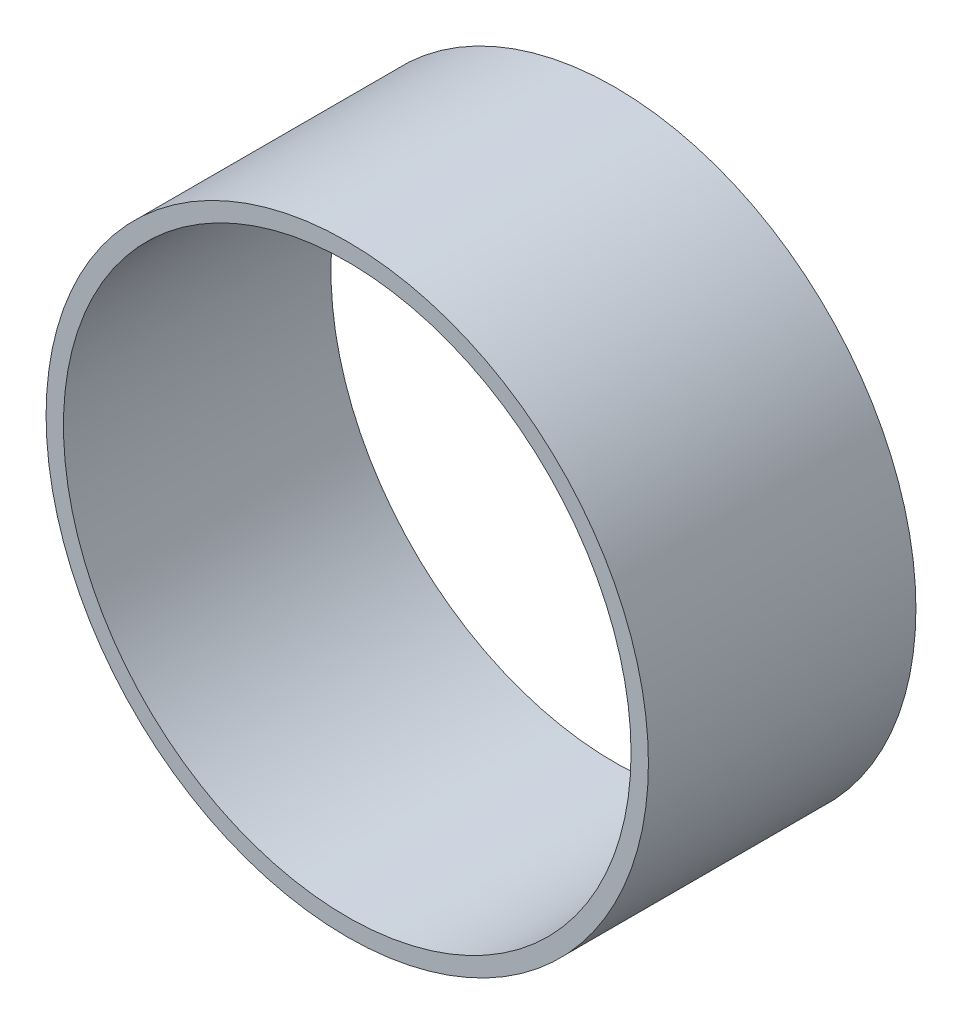
ISO-10303-21;
HEADER;
FILE_DESCRIPTION(('STEP AP214'),'2;1');
FILE_NAME('part.step','',(''),(''),'','','');
FILE_SCHEMA(('AUTOMOTIVE_DESIGN { 1 0 10303 214 1 1 1 1 }'));
ENDSEC;
DATA;
#1=APPLICATION_CONTEXT('core data for automotive mechanical design processes');
#2=APPLICATION_PROTOCOL_DEFINITION('international standard','automotive_design',2000,#1);
#3=PRODUCT_CONTEXT('',#1,'mechanical');
#4=PRODUCT('Part','Part','',(#3));
#5=PRODUCT_RELATED_PRODUCT_CATEGORY('part','',(#4));
#6=PRODUCT_DEFINITION_FORMATION('','',#4);
#7=PRODUCT_DEFINITION_CONTEXT('part definition',#1,'design');
#8=PRODUCT_DEFINITION('design','',#6,#7);
#9=PRODUCT_DEFINITION_SHAPE('','',#8);
#10=(LENGTH_UNIT() NAMED_UNIT(*) SI_UNIT(.MILLI.,.METRE.));
#11=(NAMED_UNIT(*) PLANE_ANGLE_UNIT() SI_UNIT($,.RADIAN.));
#12=(NAMED_UNIT(*) SI_UNIT($,.STERADIAN.) SOLID_ANGLE_UNIT());
#13=UNCERTAINTY_MEASURE_WITH_UNIT(LENGTH_MEASURE(1.E-05),#10,'distance_accuracy_value','');
#14=(GEOMETRIC_REPRESENTATION_CONTEXT(3) GLOBAL_UNCERTAINTY_ASSIGNED_CONTEXT((#13)) GLOBAL_UNIT_ASSIGNED_CONTEXT((#10,
#11,#12)) REPRESENTATION_CONTEXT('',''));
#15=CARTESIAN_POINT('',(0.,0.,0.));
#16=DIRECTION('',(0.,0.,1.));
#17=DIRECTION('',(1.,0.,0.));
#18=AXIS2_PLACEMENT_3D('',#15,#16,#17);
#19=CARTESIAN_POINT('',(0.,0.,0.));
#20=DIRECTION('',(0.,0.,-1.));
#21=DIRECTION('',(1.,0.,0.));
#22=AXIS2_PLACEMENT_3D('',#19,#20,#21);
#23=CYLINDRICAL_SURFACE('',#22,0.44040044);
#24=CARTESIAN_POINT('',(0.,0.,0.39116));
#25=DIRECTION('',(0.,0.,1.));
#26=DIRECTION('',(1.,0.,0.));
#27=AXIS2_PLACEMENT_3D('',#24,#25,#26);
#28=CIRCLE('',#27,0.44040044);
#29=CARTESIAN_POINT('',(0.44040044,0.,0.39116));
#30=VERTEX_POINT('',#29);
#31=EDGE_CURVE('E11',#30,#30,#28,.T.);
#32=ORIENTED_EDGE('',*,*,#31,.F.);
#33=DIRECTION('',(0.,0.,1.));
#34=VECTOR('',#33,1.);
#35=CARTESIAN_POINT('',(0.44040044,0.,0.));
#36=LINE('',#35,#34);
#37=CARTESIAN_POINT('',(0.44040044,0.,0.));
#38=VERTEX_POINT('',#37);
#39=EDGE_CURVE('E24',#38,#30,#36,.T.);
#40=ORIENTED_EDGE('',*,*,#39,.F.);
#41=CARTESIAN_POINT('',(0.,0.,0.));
#42=DIRECTION('',(0.,0.,1.));
#43=DIRECTION('',(1.,0.,0.));
#44=AXIS2_PLACEMENT_3D('',#41,#42,#43);
#45=CIRCLE('',#44,0.44040044);
#46=EDGE_CURVE('E46',#38,#38,#45,.T.);
#47=ORIENTED_EDGE('',*,*,#46,.T.);
#48=ORIENTED_EDGE('',*,*,#39,.T.);
#49=EDGE_LOOP('',(#32,#40,#47,#48));
#50=FACE_BOUND('',#49,.T.);
#51=ADVANCED_FACE('F17',(#50),#23,.T.);
#52=CARTESIAN_POINT('',(0.,0.,0.));
#53=DIRECTION('',(0.,0.,-1.));
#54=DIRECTION('',(1.,0.,0.));
#55=AXIS2_PLACEMENT_3D('',#52,#53,#54);
#56=CYLINDRICAL_SURFACE('',#55,0.41500044);
#57=DIRECTION('',(0.,0.,1.));
#58=VECTOR('',#57,1.);
#59=CARTESIAN_POINT('',(0.41500044,0.,0.));
#60=LINE('',#59,#58);
#61=CARTESIAN_POINT('',(0.41500044,0.,0.));
#62=VERTEX_POINT('',#61);
#63=CARTESIAN_POINT('',(0.41500044,0.,0.39116));
#64=VERTEX_POINT('',#63);
#65=EDGE_CURVE('E40',#62,#64,#60,.T.);
#66=ORIENTED_EDGE('',*,*,#65,.T.);
#67=CARTESIAN_POINT('',(0.,0.,0.39116));
#68=DIRECTION('',(0.,0.,1.));
#69=DIRECTION('',(1.,0.,0.));
#70=AXIS2_PLACEMENT_3D('',#67,#68,#69);
#71=CIRCLE('',#70,0.41500044);
#72=EDGE_CURVE('E45',#64,#64,#71,.T.);
#73=ORIENTED_EDGE('',*,*,#72,.T.);
#74=ORIENTED_EDGE('',*,*,#65,.F.);
#75=CARTESIAN_POINT('',(0.,0.,0.));
#76=DIRECTION('',(0.,0.,1.));
#77=DIRECTION('',(1.,0.,0.));
#78=AXIS2_PLACEMENT_3D('',#75,#76,#77);
#79=CIRCLE('',#78,0.41500044);
#80=EDGE_CURVE('E43',#62,#62,#79,.T.);
#81=ORIENTED_EDGE('',*,*,#80,.F.);
#82=EDGE_LOOP('',(#66,#73,#74,#81));
#83=FACE_BOUND('',#82,.T.);
#84=ADVANCED_FACE('F42',(#83),#56,.F.);
#85=CARTESIAN_POINT('',(0.44040044,0.,0.));
#86=DIRECTION('',(0.,0.,-1.));
#87=DIRECTION('',(-1.,0.,0.));
#88=AXIS2_PLACEMENT_3D('',#85,#86,#87);
#89=PLANE('',#88);
#90=ORIENTED_EDGE('',*,*,#46,.F.);
#91=EDGE_LOOP('',(#90));
#92=FACE_BOUND('',#91,.T.);
#93=ORIENTED_EDGE('',*,*,#80,.T.);
#94=EDGE_LOOP('',(#93));
#95=FACE_BOUND('',#94,.T.);
#96=ADVANCED_FACE('F49',(#92,#95),#89,.T.);
#97=CARTESIAN_POINT('',(0.44040044,0.,0.39116));
#98=DIRECTION('',(0.,0.,-1.));
#99=DIRECTION('',(-1.,0.,0.));
#100=AXIS2_PLACEMENT_3D('',#97,#98,#99);
#101=PLANE('',#100);
#102=ORIENTED_EDGE('',*,*,#31,.T.);
#103=EDGE_LOOP('',(#102));
#104=FACE_BOUND('',#103,.T.);
#105=ORIENTED_EDGE('',*,*,#72,.F.);
#106=EDGE_LOOP('',(#105));
#107=FACE_BOUND('',#106,.T.);
#108=ADVANCED_FACE('F56',(#104,#107),#101,.F.);
#109=CLOSED_SHELL('',(#51,#84,#96,#108));
#110=MANIFOLD_SOLID_BREP('B1',#109);
#111=ADVANCED_BREP_SHAPE_REPRESENTATION('',(#18,#110),#14);
#112=SHAPE_DEFINITION_REPRESENTATION(#9,#111);
ENDSEC;
END-ISO-10303-21;
